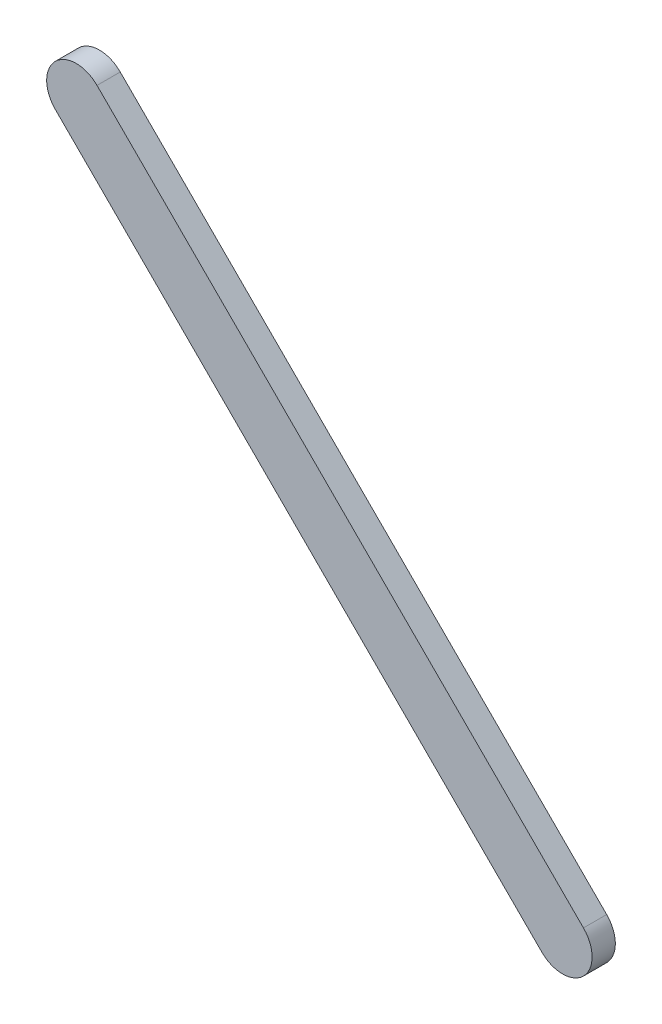
ISO-10303-21;
HEADER;
FILE_DESCRIPTION(('STEP AP214'),'2;1');
FILE_NAME('part.step','',(''),(''),'','','');
FILE_SCHEMA(('AUTOMOTIVE_DESIGN { 1 0 10303 214 1 1 1 1 }'));
ENDSEC;
DATA;
#1=APPLICATION_CONTEXT('core data for automotive mechanical design processes');
#2=APPLICATION_PROTOCOL_DEFINITION('international standard','automotive_design',2000,#1);
#3=PRODUCT_CONTEXT('',#1,'mechanical');
#4=PRODUCT('Part','Part','',(#3));
#5=PRODUCT_RELATED_PRODUCT_CATEGORY('part','',(#4));
#6=PRODUCT_DEFINITION_FORMATION('','',#4);
#7=PRODUCT_DEFINITION_CONTEXT('part definition',#1,'design');
#8=PRODUCT_DEFINITION('design','',#6,#7);
#9=PRODUCT_DEFINITION_SHAPE('','',#8);
#10=(LENGTH_UNIT() NAMED_UNIT(*) SI_UNIT(.MILLI.,.METRE.));
#11=(NAMED_UNIT(*) PLANE_ANGLE_UNIT() SI_UNIT($,.RADIAN.));
#12=(NAMED_UNIT(*) SI_UNIT($,.STERADIAN.) SOLID_ANGLE_UNIT());
#13=UNCERTAINTY_MEASURE_WITH_UNIT(LENGTH_MEASURE(1.E-05),#10,'distance_accuracy_value','');
#14=(GEOMETRIC_REPRESENTATION_CONTEXT(3) GLOBAL_UNCERTAINTY_ASSIGNED_CONTEXT((#13)) GLOBAL_UNIT_ASSIGNED_CONTEXT((#10,
#11,#12)) REPRESENTATION_CONTEXT('',''));
#15=CARTESIAN_POINT('',(0.,0.,0.));
#16=DIRECTION('',(0.,0.,1.));
#17=DIRECTION('',(1.,0.,0.));
#18=AXIS2_PLACEMENT_3D('',#15,#16,#17);
#19=CARTESIAN_POINT('',(107.05919406,73.09939406,0.));
#20=DIRECTION('',(0.707106781186548,0.707106781186548,0.));
#21=DIRECTION('',(0.707106781186548,-0.707106781186548,0.));
#22=AXIS2_PLACEMENT_3D('',#19,#20,#21);
#23=PLANE('',#22);
#24=DIRECTION('',(0.707106781186548,-0.707106781186548,0.));
#25=VECTOR('',#24,1.);
#26=CARTESIAN_POINT('',(107.05919406,73.09939406,0.1999996));
#27=LINE('',#26,#25);
#28=CARTESIAN_POINT('',(107.05919406,73.09939406,0.1999996));
#29=VERTEX_POINT('',#28);
#30=CARTESIAN_POINT('',(111.25019406,68.90839406,0.1999996));
#31=VERTEX_POINT('',#30);
#32=EDGE_CURVE('E11',#29,#31,#27,.T.);
#33=ORIENTED_EDGE('',*,*,#32,.F.);
#34=DIRECTION('',(0.,0.,1.));
#35=VECTOR('',#34,1.);
#36=CARTESIAN_POINT('',(107.05919406,73.09939406,0.));
#37=LINE('',#36,#35);
#38=CARTESIAN_POINT('',(107.05919406,73.09939406,0.));
#39=VERTEX_POINT('',#38);
#40=EDGE_CURVE('E24',#39,#29,#37,.T.);
#41=ORIENTED_EDGE('',*,*,#40,.F.);
#42=DIRECTION('',(0.707106781186548,-0.707106781186548,0.));
#43=VECTOR('',#42,1.);
#44=CARTESIAN_POINT('',(107.05919406,73.09939406,0.));
#45=LINE('',#44,#43);
#46=CARTESIAN_POINT('',(111.25019406,68.90839406,0.));
#47=VERTEX_POINT('',#46);
#48=EDGE_CURVE('E75',#39,#47,#45,.T.);
#49=ORIENTED_EDGE('',*,*,#48,.T.);
#50=DIRECTION('',(0.,0.,1.));
#51=VECTOR('',#50,1.);
#52=CARTESIAN_POINT('',(111.25019406,68.90839406,0.));
#53=LINE('',#52,#51);
#54=EDGE_CURVE('E37',#47,#31,#53,.T.);
#55=ORIENTED_EDGE('',*,*,#54,.T.);
#56=EDGE_LOOP('',(#33,#41,#49,#55));
#57=FACE_BOUND('',#56,.T.);
#58=ADVANCED_FACE('F17',(#57),#23,.F.);
#59=CARTESIAN_POINT('',(111.4298,69.088,0.));
#60=DIRECTION('',(0.,0.,-1.));
#61=DIRECTION('',(-0.707106781186548,-0.707106781186548,0.));
#62=AXIS2_PLACEMENT_3D('',#59,#60,#61);
#63=CYLINDRICAL_SURFACE('',#62,0.254001156230771);
#64=CARTESIAN_POINT('',(111.4298,69.088,0.1999996));
#65=DIRECTION('',(0.,0.,1.));
#66=DIRECTION('',(-0.707106781186548,-0.707106781186548,0.));
#67=AXIS2_PLACEMENT_3D('',#64,#65,#66);
#68=CIRCLE('',#67,0.254001156230771);
#69=CARTESIAN_POINT('',(111.60940594,69.26760594,0.1999996));
#70=VERTEX_POINT('',#69);
#71=EDGE_CURVE('E83',#31,#70,#68,.T.);
#72=ORIENTED_EDGE('',*,*,#71,.F.);
#73=ORIENTED_EDGE('',*,*,#54,.F.);
#74=CARTESIAN_POINT('',(111.4298,69.088,0.));
#75=DIRECTION('',(0.,0.,1.));
#76=DIRECTION('',(-0.707106781186548,-0.707106781186548,0.));
#77=AXIS2_PLACEMENT_3D('',#74,#75,#76);
#78=CIRCLE('',#77,0.254001156230771);
#79=CARTESIAN_POINT('',(111.60940594,69.26760594,0.));
#80=VERTEX_POINT('',#79);
#81=EDGE_CURVE('E81',#47,#80,#78,.T.);
#82=ORIENTED_EDGE('',*,*,#81,.T.);
#83=DIRECTION('',(0.,0.,1.));
#84=VECTOR('',#83,1.);
#85=CARTESIAN_POINT('',(111.60940594,69.26760594,0.));
#86=LINE('',#85,#84);
#87=EDGE_CURVE('E67',#80,#70,#86,.T.);
#88=ORIENTED_EDGE('',*,*,#87,.T.);
#89=EDGE_LOOP('',(#72,#73,#82,#88));
#90=FACE_BOUND('',#89,.T.);
#91=ADVANCED_FACE('F89',(#90),#63,.T.);
#92=CARTESIAN_POINT('',(111.60940594,69.26760594,0.));
#93=DIRECTION('',(-0.707106781186548,-0.707106781186548,0.));
#94=DIRECTION('',(-0.707106781186548,0.707106781186548,0.));
#95=AXIS2_PLACEMENT_3D('',#92,#93,#94);
#96=PLANE('',#95);
#97=DIRECTION('',(-0.707106781186548,0.707106781186548,0.));
#98=VECTOR('',#97,1.);
#99=CARTESIAN_POINT('',(111.60940594,69.26760594,0.1999996));
#100=LINE('',#99,#98);
#101=CARTESIAN_POINT('',(107.41840594,73.45860594,0.1999996));
#102=VERTEX_POINT('',#101);
#103=EDGE_CURVE('E71',#70,#102,#100,.T.);
#104=ORIENTED_EDGE('',*,*,#103,.F.);
#105=ORIENTED_EDGE('',*,*,#87,.F.);
#106=DIRECTION('',(-0.707106781186548,0.707106781186548,0.));
#107=VECTOR('',#106,1.);
#108=CARTESIAN_POINT('',(111.60940594,69.26760594,0.));
#109=LINE('',#108,#107);
#110=CARTESIAN_POINT('',(107.41840594,73.45860594,0.));
#111=VERTEX_POINT('',#110);
#112=EDGE_CURVE('E63',#80,#111,#109,.T.);
#113=ORIENTED_EDGE('',*,*,#112,.T.);
#114=DIRECTION('',(0.,0.,1.));
#115=VECTOR('',#114,1.);
#116=CARTESIAN_POINT('',(107.41840594,73.45860594,0.));
#117=LINE('',#116,#115);
#118=EDGE_CURVE('E53',#111,#102,#117,.T.);
#119=ORIENTED_EDGE('',*,*,#118,.T.);
#120=EDGE_LOOP('',(#104,#105,#113,#119));
#121=FACE_BOUND('',#120,.T.);
#122=ADVANCED_FACE('F66',(#121),#96,.F.);
#123=CARTESIAN_POINT('',(107.2388,73.279,0.));
#124=DIRECTION('',(0.,0.,-1.));
#125=DIRECTION('',(0.707106781186548,0.707106781186548,0.));
#126=AXIS2_PLACEMENT_3D('',#123,#124,#125);
#127=CYLINDRICAL_SURFACE('',#126,0.254001156230771);
#128=CARTESIAN_POINT('',(107.2388,73.279,0.1999996));
#129=DIRECTION('',(0.,0.,1.));
#130=DIRECTION('',(0.707106781186548,0.707106781186548,0.));
#131=AXIS2_PLACEMENT_3D('',#128,#129,#130);
#132=CIRCLE('',#131,0.254001156230771);
#133=EDGE_CURVE('E59',#102,#29,#132,.T.);
#134=ORIENTED_EDGE('',*,*,#133,.F.);
#135=ORIENTED_EDGE('',*,*,#118,.F.);
#136=CARTESIAN_POINT('',(107.2388,73.279,0.));
#137=DIRECTION('',(0.,0.,1.));
#138=DIRECTION('',(0.707106781186548,0.707106781186548,0.));
#139=AXIS2_PLACEMENT_3D('',#136,#137,#138);
#140=CIRCLE('',#139,0.254001156230771);
#141=EDGE_CURVE('E57',#111,#39,#140,.T.);
#142=ORIENTED_EDGE('',*,*,#141,.T.);
#143=ORIENTED_EDGE('',*,*,#40,.T.);
#144=EDGE_LOOP('',(#134,#135,#142,#143));
#145=FACE_BOUND('',#144,.T.);
#146=ADVANCED_FACE('F55',(#145),#127,.T.);
#147=CARTESIAN_POINT('',(107.05919406,73.09939406,0.));
#148=DIRECTION('',(0.,0.,-1.));
#149=DIRECTION('',(-1.,0.,0.));
#150=AXIS2_PLACEMENT_3D('',#147,#148,#149);
#151=PLANE('',#150);
#152=ORIENTED_EDGE('',*,*,#141,.F.);
#153=ORIENTED_EDGE('',*,*,#112,.F.);
#154=ORIENTED_EDGE('',*,*,#81,.F.);
#155=ORIENTED_EDGE('',*,*,#48,.F.);
#156=EDGE_LOOP('',(#152,#153,#154,#155));
#157=FACE_BOUND('',#156,.T.);
#158=ADVANCED_FACE('F74',(#157),#151,.T.);
#159=CARTESIAN_POINT('',(107.05919406,73.09939406,0.1999996));
#160=DIRECTION('',(0.,0.,-1.));
#161=DIRECTION('',(-1.,0.,0.));
#162=AXIS2_PLACEMENT_3D('',#159,#160,#161);
#163=PLANE('',#162);
#164=ORIENTED_EDGE('',*,*,#32,.T.);
#165=ORIENTED_EDGE('',*,*,#71,.T.);
#166=ORIENTED_EDGE('',*,*,#103,.T.);
#167=ORIENTED_EDGE('',*,*,#133,.T.);
#168=EDGE_LOOP('',(#164,#165,#166,#167));
#169=FACE_BOUND('',#168,.T.);
#170=ADVANCED_FACE('F91',(#169),#163,.F.);
#171=CLOSED_SHELL('',(#58,#91,#122,#146,#158,#170));
#172=MANIFOLD_SOLID_BREP('B1',#171);
#173=ADVANCED_BREP_SHAPE_REPRESENTATION('',(#18,#172),#14);
#174=SHAPE_DEFINITION_REPRESENTATION(#9,#173);
ENDSEC;
END-ISO-10303-21;
